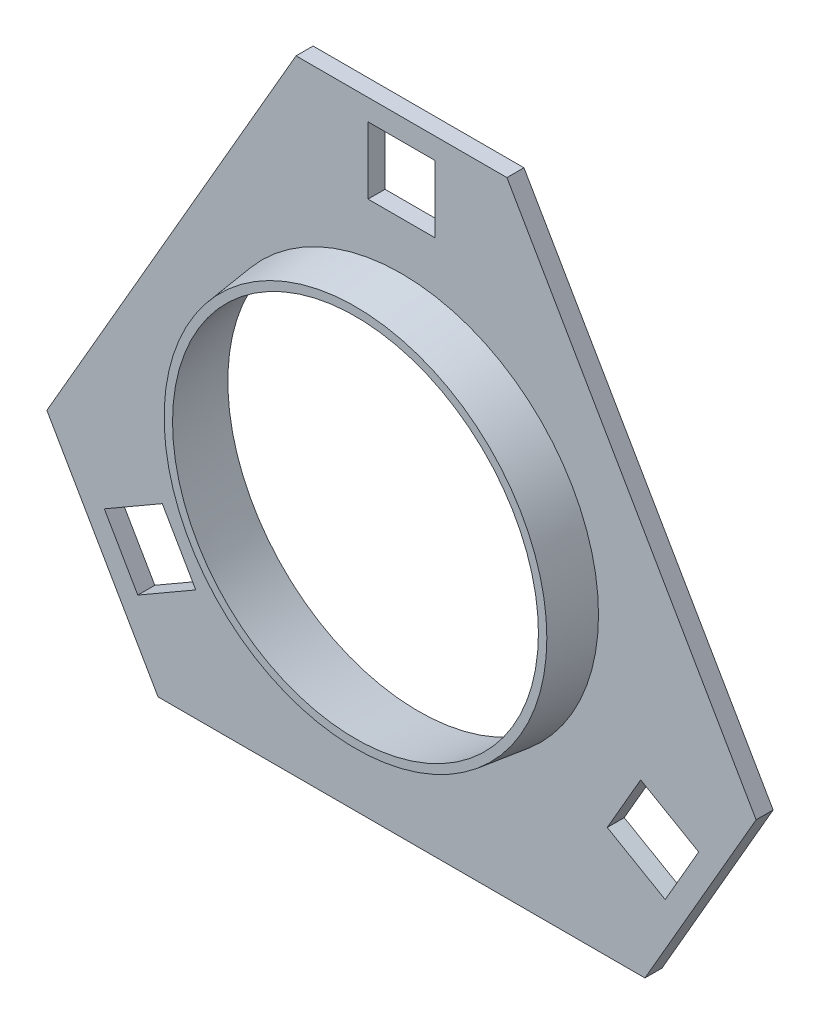
ISO-10303-21;
HEADER;
FILE_DESCRIPTION(('STEP AP214'),'2;1');
FILE_NAME('part.step','',(''),(''),'','','');
FILE_SCHEMA(('AUTOMOTIVE_DESIGN { 1 0 10303 214 1 1 1 1 }'));
ENDSEC;
DATA;
#1=APPLICATION_CONTEXT('core data for automotive mechanical design processes');
#2=APPLICATION_PROTOCOL_DEFINITION('international standard','automotive_design',2000,#1);
#3=PRODUCT_CONTEXT('',#1,'mechanical');
#4=PRODUCT('Part','Part','',(#3));
#5=PRODUCT_RELATED_PRODUCT_CATEGORY('part','',(#4));
#6=PRODUCT_DEFINITION_FORMATION('','',#4);
#7=PRODUCT_DEFINITION_CONTEXT('part definition',#1,'design');
#8=PRODUCT_DEFINITION('design','',#6,#7);
#9=PRODUCT_DEFINITION_SHAPE('','',#8);
#10=(LENGTH_UNIT() NAMED_UNIT(*) SI_UNIT(.MILLI.,.METRE.));
#11=(NAMED_UNIT(*) PLANE_ANGLE_UNIT() SI_UNIT($,.RADIAN.));
#12=(NAMED_UNIT(*) SI_UNIT($,.STERADIAN.) SOLID_ANGLE_UNIT());
#13=UNCERTAINTY_MEASURE_WITH_UNIT(LENGTH_MEASURE(1.E-05),#10,'distance_accuracy_value','');
#14=(GEOMETRIC_REPRESENTATION_CONTEXT(3) GLOBAL_UNCERTAINTY_ASSIGNED_CONTEXT((#13)) GLOBAL_UNIT_ASSIGNED_CONTEXT((#10,
#11,#12)) REPRESENTATION_CONTEXT('',''));
#15=CARTESIAN_POINT('',(0.,0.,0.));
#16=DIRECTION('',(0.,0.,1.));
#17=DIRECTION('',(1.,0.,0.));
#18=AXIS2_PLACEMENT_3D('',#15,#16,#17);
#19=CARTESIAN_POINT('',(0.,0.,2.22));
#20=DIRECTION('',(0.,0.,1.));
#21=DIRECTION('',(1.,0.,0.));
#22=AXIS2_PLACEMENT_3D('',#19,#20,#21);
#23=PLANE('',#22);
#24=DIRECTION('',(-0.499999999999999,-0.866025403784439,0.));
#25=VECTOR('',#24,1.);
#26=CARTESIAN_POINT('',(31.1972270943654,22.1025692423934,2.22));
#27=LINE('',#26,#25);
#28=CARTESIAN_POINT('',(31.1972270943654,22.1025692423934,2.22));
#29=VERTEX_POINT('',#28);
#30=CARTESIAN_POINT('',(26.8322270943654,14.5421674673553,2.22));
#31=VERTEX_POINT('',#30);
#32=EDGE_CURVE('E165',#29,#31,#27,.T.);
#33=ORIENTED_EDGE('',*,*,#32,.F.);
#34=DIRECTION('',(-0.866025403784439,0.5,0.));
#35=VECTOR('',#34,1.);
#36=CARTESIAN_POINT('',(38.7576288694036,17.7375692423934,2.22));
#37=LINE('',#36,#35);
#38=CARTESIAN_POINT('',(38.7576288694036,17.7375692423934,2.22));
#39=VERTEX_POINT('',#38);
#40=EDGE_CURVE('E157',#39,#29,#37,.T.);
#41=ORIENTED_EDGE('',*,*,#40,.F.);
#42=DIRECTION('',(0.499999999999999,0.866025403784439,0.));
#43=VECTOR('',#42,1.);
#44=CARTESIAN_POINT('',(34.3926288694035,10.1771674673551,2.22));
#45=LINE('',#44,#43);
#46=CARTESIAN_POINT('',(34.3926288694035,10.1771674673551,2.22));
#47=VERTEX_POINT('',#46);
#48=EDGE_CURVE('E180',#47,#39,#45,.T.);
#49=ORIENTED_EDGE('',*,*,#48,.F.);
#50=DIRECTION('',(0.866025403784429,-0.500000000000017,0.));
#51=VECTOR('',#50,1.);
#52=CARTESIAN_POINT('',(26.8322270943654,14.5421674673553,2.22));
#53=LINE('',#52,#51);
#54=EDGE_CURVE('E178',#31,#47,#53,.T.);
#55=ORIENTED_EDGE('',*,*,#54,.F.);
#56=EDGE_LOOP('',(#33,#41,#49,#55));
#57=FACE_BOUND('',#56,.T.);
#58=DIRECTION('',(-0.86602540378444,-0.499999999999999,0.));
#59=VECTOR('',#58,1.);
#60=CARTESIAN_POINT('',(-38.7576288694036,17.7375692423934,2.22));
#61=LINE('',#60,#59);
#62=CARTESIAN_POINT('',(-31.1972270943654,22.1025692423934,2.22));
#63=VERTEX_POINT('',#62);
#64=CARTESIAN_POINT('',(-38.7576288694036,17.7375692423934,2.22));
#65=VERTEX_POINT('',#64);
#66=EDGE_CURVE('E229',#63,#65,#61,.T.);
#67=ORIENTED_EDGE('',*,*,#66,.F.);
#68=DIRECTION('',(-0.5,0.866025403784439,0.));
#69=VECTOR('',#68,1.);
#70=CARTESIAN_POINT('',(-31.1972270943654,22.1025692423934,2.22));
#71=LINE('',#70,#69);
#72=CARTESIAN_POINT('',(-26.8322270943654,14.5421674673553,2.22));
#73=VERTEX_POINT('',#72);
#74=EDGE_CURVE('E227',#73,#63,#71,.T.);
#75=ORIENTED_EDGE('',*,*,#74,.F.);
#76=DIRECTION('',(0.866025403784429,0.500000000000017,0.));
#77=VECTOR('',#76,1.);
#78=CARTESIAN_POINT('',(-26.8322270943654,14.5421674673553,2.22));
#79=LINE('',#78,#77);
#80=CARTESIAN_POINT('',(-34.3926288694035,10.1771674673551,2.22));
#81=VERTEX_POINT('',#80);
#82=EDGE_CURVE('E235',#81,#73,#79,.T.);
#83=ORIENTED_EDGE('',*,*,#82,.F.);
#84=DIRECTION('',(0.499999999999999,-0.866025403784439,0.));
#85=VECTOR('',#84,1.);
#86=CARTESIAN_POINT('',(-34.3926288694035,10.1771674673551,2.22));
#87=LINE('',#86,#85);
#88=EDGE_CURVE('E232',#65,#81,#87,.T.);
#89=ORIENTED_EDGE('',*,*,#88,.F.);
#90=EDGE_LOOP('',(#67,#75,#83,#89));
#91=FACE_BOUND('',#90,.T.);
#92=DIRECTION('',(0.499999999999998,0.86602540378444,0.));
#93=VECTOR('',#92,1.);
#94=CARTESIAN_POINT('',(31.75,0.,2.22));
#95=LINE('',#94,#93);
#96=CARTESIAN_POINT('',(31.75,0.,2.22));
#97=VERTEX_POINT('',#96);
#98=CARTESIAN_POINT('',(46.2499999999999,25.1147367097488,2.22));
#99=VERTEX_POINT('',#98);
#100=EDGE_CURVE('E258',#97,#99,#95,.T.);
#101=ORIENTED_EDGE('',*,*,#100,.T.);
#102=DIRECTION('',(-0.500000000000004,0.866025403784436,0.));
#103=VECTOR('',#102,1.);
#104=CARTESIAN_POINT('',(46.2499999999999,25.1147367097488,2.22));
#105=LINE('',#104,#103);
#106=CARTESIAN_POINT('',(13.7499999999997,81.4063879557371,2.22));
#107=VERTEX_POINT('',#106);
#108=EDGE_CURVE('E261',#99,#107,#105,.T.);
#109=ORIENTED_EDGE('',*,*,#108,.T.);
#110=DIRECTION('',(-1.,0.,0.));
#111=VECTOR('',#110,1.);
#112=CARTESIAN_POINT('',(13.7499999999997,81.4063879557371,2.22));
#113=LINE('',#112,#111);
#114=CARTESIAN_POINT('',(-13.7499999999997,81.4063879557371,2.22));
#115=VERTEX_POINT('',#114);
#116=EDGE_CURVE('E264',#107,#115,#113,.T.);
#117=ORIENTED_EDGE('',*,*,#116,.T.);
#118=DIRECTION('',(-0.500000000000004,-0.866025403784437,0.));
#119=VECTOR('',#118,1.);
#120=CARTESIAN_POINT('',(-46.2499999999999,25.1147367097487,2.22));
#121=LINE('',#120,#119);
#122=CARTESIAN_POINT('',(-46.2499999999999,25.1147367097487,2.22));
#123=VERTEX_POINT('',#122);
#124=EDGE_CURVE('E266',#115,#123,#121,.T.);
#125=ORIENTED_EDGE('',*,*,#124,.T.);
#126=DIRECTION('',(0.499999999999998,-0.86602540378444,0.));
#127=VECTOR('',#126,1.);
#128=CARTESIAN_POINT('',(-31.75,0.,2.22));
#129=LINE('',#128,#127);
#130=CARTESIAN_POINT('',(-31.75,0.,2.22));
#131=VERTEX_POINT('',#130);
#132=EDGE_CURVE('E268',#123,#131,#129,.T.);
#133=ORIENTED_EDGE('',*,*,#132,.T.);
#134=DIRECTION('',(1.,0.,0.));
#135=VECTOR('',#134,1.);
#136=CARTESIAN_POINT('',(-31.75,0.,2.22));
#137=LINE('',#136,#135);
#138=EDGE_CURVE('E270',#131,#97,#137,.T.);
#139=ORIENTED_EDGE('',*,*,#138,.T.);
#140=EDGE_LOOP('',(#101,#109,#117,#125,#133,#139));
#141=FACE_BOUND('',#140,.T.);
#142=DIRECTION('',(-1.,0.,0.));
#143=VECTOR('',#142,1.);
#144=CARTESIAN_POINT('',(-4.365,78.6463879557371,2.22));
#145=LINE('',#144,#143);
#146=CARTESIAN_POINT('',(4.365,78.6463879557371,2.22));
#147=VERTEX_POINT('',#146);
#148=CARTESIAN_POINT('',(-4.365,78.6463879557371,2.22));
#149=VERTEX_POINT('',#148);
#150=EDGE_CURVE('E198',#147,#149,#145,.T.);
#151=ORIENTED_EDGE('',*,*,#150,.F.);
#152=DIRECTION('',(0.,1.,0.));
#153=VECTOR('',#152,1.);
#154=CARTESIAN_POINT('',(4.365,78.6463879557371,2.22));
#155=LINE('',#154,#153);
#156=CARTESIAN_POINT('',(4.365,69.9163879557371,2.22));
#157=VERTEX_POINT('',#156);
#158=EDGE_CURVE('E196',#157,#147,#155,.T.);
#159=ORIENTED_EDGE('',*,*,#158,.F.);
#160=DIRECTION('',(1.,0.,0.));
#161=VECTOR('',#160,1.);
#162=CARTESIAN_POINT('',(4.365,69.9163879557371,2.22));
#163=LINE('',#162,#161);
#164=CARTESIAN_POINT('',(-4.365,69.9163879557371,2.22));
#165=VERTEX_POINT('',#164);
#166=EDGE_CURVE('E204',#165,#157,#163,.T.);
#167=ORIENTED_EDGE('',*,*,#166,.F.);
#168=DIRECTION('',(0.,-1.,0.));
#169=VECTOR('',#168,1.);
#170=CARTESIAN_POINT('',(-4.365,78.6463879557371,2.22));
#171=LINE('',#170,#169);
#172=EDGE_CURVE('E201',#149,#165,#171,.T.);
#173=ORIENTED_EDGE('',*,*,#172,.F.);
#174=EDGE_LOOP('',(#151,#159,#167,#173));
#175=FACE_BOUND('',#174,.T.);
#176=CARTESIAN_POINT('',(0.,38.,2.22));
#177=DIRECTION('',(0.,0.,1.));
#178=DIRECTION('',(1.,0.,0.));
#179=AXIS2_PLACEMENT_3D('',#176,#177,#178);
#180=CIRCLE('',#179,25.695);
#181=CARTESIAN_POINT('',(25.695,38.,2.22));
#182=VERTEX_POINT('',#181);
#183=EDGE_CURVE('E405',#182,#182,#180,.T.);
#184=ORIENTED_EDGE('',*,*,#183,.F.);
#185=EDGE_LOOP('',(#184));
#186=FACE_BOUND('',#185,.T.);
#187=ADVANCED_FACE('F32',(#57,#91,#141,#175,#186),#23,.T.);
#188=CARTESIAN_POINT('',(0.,0.,0.));
#189=DIRECTION('',(0.,0.,1.));
#190=DIRECTION('',(1.,0.,0.));
#191=AXIS2_PLACEMENT_3D('',#188,#189,#190);
#192=PLANE('',#191);
#193=CARTESIAN_POINT('',(0.,38.,0.));
#194=DIRECTION('',(0.,0.,1.));
#195=DIRECTION('',(1.,0.,0.));
#196=AXIS2_PLACEMENT_3D('',#193,#194,#195);
#197=CIRCLE('',#196,24.8692890906219);
#198=CARTESIAN_POINT('',(24.8692890906219,38.,0.));
#199=VERTEX_POINT('',#198);
#200=EDGE_CURVE('E400',#199,#199,#197,.T.);
#201=ORIENTED_EDGE('',*,*,#200,.T.);
#202=EDGE_LOOP('',(#201));
#203=FACE_BOUND('',#202,.T.);
#204=DIRECTION('',(0.,1.,0.));
#205=VECTOR('',#204,1.);
#206=CARTESIAN_POINT('',(4.365,78.6463879557371,0.));
#207=LINE('',#206,#205);
#208=CARTESIAN_POINT('',(4.365,69.9163879557371,0.));
#209=VERTEX_POINT('',#208);
#210=CARTESIAN_POINT('',(4.365,78.6463879557371,0.));
#211=VERTEX_POINT('',#210);
#212=EDGE_CURVE('E173',#209,#211,#207,.T.);
#213=ORIENTED_EDGE('',*,*,#212,.T.);
#214=DIRECTION('',(-1.,0.,0.));
#215=VECTOR('',#214,1.);
#216=CARTESIAN_POINT('',(-4.365,78.6463879557371,0.));
#217=LINE('',#216,#215);
#218=CARTESIAN_POINT('',(-4.365,78.6463879557371,0.));
#219=VERTEX_POINT('',#218);
#220=EDGE_CURVE('E209',#211,#219,#217,.T.);
#221=ORIENTED_EDGE('',*,*,#220,.T.);
#222=DIRECTION('',(0.,-1.,0.));
#223=VECTOR('',#222,1.);
#224=CARTESIAN_POINT('',(-4.365,78.6463879557371,0.));
#225=LINE('',#224,#223);
#226=CARTESIAN_POINT('',(-4.365,69.9163879557371,0.));
#227=VERTEX_POINT('',#226);
#228=EDGE_CURVE('E212',#219,#227,#225,.T.);
#229=ORIENTED_EDGE('',*,*,#228,.T.);
#230=DIRECTION('',(1.,0.,0.));
#231=VECTOR('',#230,1.);
#232=CARTESIAN_POINT('',(4.365,69.9163879557371,0.));
#233=LINE('',#232,#231);
#234=EDGE_CURVE('E199',#227,#209,#233,.T.);
#235=ORIENTED_EDGE('',*,*,#234,.T.);
#236=EDGE_LOOP('',(#213,#221,#229,#235));
#237=FACE_BOUND('',#236,.T.);
#238=DIRECTION('',(0.499999999999998,0.86602540378444,0.));
#239=VECTOR('',#238,1.);
#240=CARTESIAN_POINT('',(31.75,0.,0.));
#241=LINE('',#240,#239);
#242=CARTESIAN_POINT('',(31.75,0.,0.));
#243=VERTEX_POINT('',#242);
#244=CARTESIAN_POINT('',(46.2499999999999,25.1147367097488,0.));
#245=VERTEX_POINT('',#244);
#246=EDGE_CURVE('E257',#243,#245,#241,.T.);
#247=ORIENTED_EDGE('',*,*,#246,.F.);
#248=DIRECTION('',(1.,0.,0.));
#249=VECTOR('',#248,1.);
#250=CARTESIAN_POINT('',(-31.75,0.,0.));
#251=LINE('',#250,#249);
#252=CARTESIAN_POINT('',(-31.75,0.,0.));
#253=VERTEX_POINT('',#252);
#254=EDGE_CURVE('E262',#253,#243,#251,.T.);
#255=ORIENTED_EDGE('',*,*,#254,.F.);
#256=DIRECTION('',(0.499999999999998,-0.86602540378444,0.));
#257=VECTOR('',#256,1.);
#258=CARTESIAN_POINT('',(-31.75,0.,0.));
#259=LINE('',#258,#257);
#260=CARTESIAN_POINT('',(-46.2499999999999,25.1147367097487,0.));
#261=VERTEX_POINT('',#260);
#262=EDGE_CURVE('E281',#261,#253,#259,.T.);
#263=ORIENTED_EDGE('',*,*,#262,.F.);
#264=DIRECTION('',(-0.500000000000004,-0.866025403784437,0.));
#265=VECTOR('',#264,1.);
#266=CARTESIAN_POINT('',(-46.2499999999999,25.1147367097487,0.));
#267=LINE('',#266,#265);
#268=CARTESIAN_POINT('',(-13.7499999999997,81.4063879557371,0.));
#269=VERTEX_POINT('',#268);
#270=EDGE_CURVE('E279',#269,#261,#267,.T.);
#271=ORIENTED_EDGE('',*,*,#270,.F.);
#272=DIRECTION('',(-1.,0.,0.));
#273=VECTOR('',#272,1.);
#274=CARTESIAN_POINT('',(13.7499999999997,81.4063879557371,0.));
#275=LINE('',#274,#273);
#276=CARTESIAN_POINT('',(13.7499999999997,81.4063879557371,0.));
#277=VERTEX_POINT('',#276);
#278=EDGE_CURVE('E277',#277,#269,#275,.T.);
#279=ORIENTED_EDGE('',*,*,#278,.F.);
#280=DIRECTION('',(-0.500000000000004,0.866025403784436,0.));
#281=VECTOR('',#280,1.);
#282=CARTESIAN_POINT('',(46.2499999999999,25.1147367097488,0.));
#283=LINE('',#282,#281);
#284=EDGE_CURVE('E275',#245,#277,#283,.T.);
#285=ORIENTED_EDGE('',*,*,#284,.F.);
#286=EDGE_LOOP('',(#247,#255,#263,#271,#279,#285));
#287=FACE_BOUND('',#286,.T.);
#288=DIRECTION('',(-0.5,0.866025403784439,0.));
#289=VECTOR('',#288,1.);
#290=CARTESIAN_POINT('',(-31.1972270943654,22.1025692423934,0.));
#291=LINE('',#290,#289);
#292=CARTESIAN_POINT('',(-26.8322270943654,14.5421674673553,0.));
#293=VERTEX_POINT('',#292);
#294=CARTESIAN_POINT('',(-31.1972270943654,22.1025692423934,0.));
#295=VERTEX_POINT('',#294);
#296=EDGE_CURVE('E226',#293,#295,#291,.T.);
#297=ORIENTED_EDGE('',*,*,#296,.T.);
#298=DIRECTION('',(-0.86602540378444,-0.499999999999999,0.));
#299=VECTOR('',#298,1.);
#300=CARTESIAN_POINT('',(-38.7576288694036,17.7375692423934,0.));
#301=LINE('',#300,#299);
#302=CARTESIAN_POINT('',(-38.7576288694036,17.7375692423934,0.));
#303=VERTEX_POINT('',#302);
#304=EDGE_CURVE('E240',#295,#303,#301,.T.);
#305=ORIENTED_EDGE('',*,*,#304,.T.);
#306=DIRECTION('',(0.499999999999999,-0.866025403784439,0.));
#307=VECTOR('',#306,1.);
#308=CARTESIAN_POINT('',(-34.3926288694035,10.1771674673551,0.));
#309=LINE('',#308,#307);
#310=CARTESIAN_POINT('',(-34.3926288694035,10.1771674673551,0.));
#311=VERTEX_POINT('',#310);
#312=EDGE_CURVE('E243',#303,#311,#309,.T.);
#313=ORIENTED_EDGE('',*,*,#312,.T.);
#314=DIRECTION('',(0.866025403784429,0.500000000000017,0.));
#315=VECTOR('',#314,1.);
#316=CARTESIAN_POINT('',(-26.8322270943654,14.5421674673553,0.));
#317=LINE('',#316,#315);
#318=EDGE_CURVE('E230',#311,#293,#317,.T.);
#319=ORIENTED_EDGE('',*,*,#318,.T.);
#320=EDGE_LOOP('',(#297,#305,#313,#319));
#321=FACE_BOUND('',#320,.T.);
#322=DIRECTION('',(-0.866025403784439,0.5,0.));
#323=VECTOR('',#322,1.);
#324=CARTESIAN_POINT('',(38.7576288694036,17.7375692423934,0.));
#325=LINE('',#324,#323);
#326=CARTESIAN_POINT('',(38.7576288694036,17.7375692423934,0.));
#327=VERTEX_POINT('',#326);
#328=CARTESIAN_POINT('',(31.1972270943654,22.1025692423934,0.));
#329=VERTEX_POINT('',#328);
#330=EDGE_CURVE('E55',#327,#329,#325,.T.);
#331=ORIENTED_EDGE('',*,*,#330,.T.);
#332=DIRECTION('',(-0.499999999999999,-0.866025403784439,0.));
#333=VECTOR('',#332,1.);
#334=CARTESIAN_POINT('',(31.1972270943654,22.1025692423934,0.));
#335=LINE('',#334,#333);
#336=CARTESIAN_POINT('',(26.8322270943654,14.5421674673553,0.));
#337=VERTEX_POINT('',#336);
#338=EDGE_CURVE('E172',#329,#337,#335,.T.);
#339=ORIENTED_EDGE('',*,*,#338,.T.);
#340=DIRECTION('',(0.866025403784429,-0.500000000000017,0.));
#341=VECTOR('',#340,1.);
#342=CARTESIAN_POINT('',(26.8322270943654,14.5421674673553,0.));
#343=LINE('',#342,#341);
#344=CARTESIAN_POINT('',(34.3926288694035,10.1771674673551,0.));
#345=VERTEX_POINT('',#344);
#346=EDGE_CURVE('E188',#337,#345,#343,.T.);
#347=ORIENTED_EDGE('',*,*,#346,.T.);
#348=DIRECTION('',(0.499999999999999,0.866025403784439,0.));
#349=VECTOR('',#348,1.);
#350=CARTESIAN_POINT('',(34.3926288694035,10.1771674673551,0.));
#351=LINE('',#350,#349);
#352=EDGE_CURVE('E166',#345,#327,#351,.T.);
#353=ORIENTED_EDGE('',*,*,#352,.T.);
#354=EDGE_LOOP('',(#331,#339,#347,#353));
#355=FACE_BOUND('',#354,.T.);
#356=ADVANCED_FACE('F305',(#203,#237,#287,#321,#355),#192,.F.);
#357=CARTESIAN_POINT('',(31.75,0.,2.22));
#358=DIRECTION('',(-0.86602540378444,0.499999999999998,0.));
#359=DIRECTION('',(-0.499999999999998,-0.86602540378444,0.));
#360=AXIS2_PLACEMENT_3D('',#357,#358,#359);
#361=PLANE('',#360);
#362=ORIENTED_EDGE('',*,*,#246,.T.);
#363=DIRECTION('',(0.,0.,-1.));
#364=VECTOR('',#363,1.);
#365=CARTESIAN_POINT('',(46.2499999999999,25.1147367097488,2.22));
#366=LINE('',#365,#364);
#367=EDGE_CURVE('E11',#99,#245,#366,.T.);
#368=ORIENTED_EDGE('',*,*,#367,.F.);
#369=ORIENTED_EDGE('',*,*,#100,.F.);
#370=DIRECTION('',(0.,0.,-1.));
#371=VECTOR('',#370,1.);
#372=CARTESIAN_POINT('',(31.75,0.,2.22));
#373=LINE('',#372,#371);
#374=EDGE_CURVE('E272',#97,#243,#373,.T.);
#375=ORIENTED_EDGE('',*,*,#374,.T.);
#376=EDGE_LOOP('',(#362,#368,#369,#375));
#377=FACE_BOUND('',#376,.T.);
#378=ADVANCED_FACE('F34',(#377),#361,.F.);
#379=CARTESIAN_POINT('',(46.2499999999999,25.1147367097488,2.22));
#380=DIRECTION('',(-0.866025403784436,-0.500000000000004,0.));
#381=DIRECTION('',(0.500000000000004,-0.866025403784437,0.));
#382=AXIS2_PLACEMENT_3D('',#379,#380,#381);
#383=PLANE('',#382);
#384=ORIENTED_EDGE('',*,*,#284,.T.);
#385=DIRECTION('',(0.,0.,-1.));
#386=VECTOR('',#385,1.);
#387=CARTESIAN_POINT('',(13.7499999999997,81.4063879557371,2.22));
#388=LINE('',#387,#386);
#389=EDGE_CURVE('E40',#107,#277,#388,.T.);
#390=ORIENTED_EDGE('',*,*,#389,.F.);
#391=ORIENTED_EDGE('',*,*,#108,.F.);
#392=ORIENTED_EDGE('',*,*,#367,.T.);
#393=EDGE_LOOP('',(#384,#390,#391,#392));
#394=FACE_BOUND('',#393,.T.);
#395=ADVANCED_FACE('F323',(#394),#383,.F.);
#396=CARTESIAN_POINT('',(13.7499999999997,81.4063879557371,2.22));
#397=DIRECTION('',(0.,-1.,0.));
#398=DIRECTION('',(0.,0.,-1.));
#399=AXIS2_PLACEMENT_3D('',#396,#397,#398);
#400=PLANE('',#399);
#401=ORIENTED_EDGE('',*,*,#278,.T.);
#402=DIRECTION('',(0.,0.,-1.));
#403=VECTOR('',#402,1.);
#404=CARTESIAN_POINT('',(-13.7499999999997,81.4063879557371,2.22));
#405=LINE('',#404,#403);
#406=EDGE_CURVE('E292',#115,#269,#405,.T.);
#407=ORIENTED_EDGE('',*,*,#406,.F.);
#408=ORIENTED_EDGE('',*,*,#116,.F.);
#409=ORIENTED_EDGE('',*,*,#389,.T.);
#410=EDGE_LOOP('',(#401,#407,#408,#409));
#411=FACE_BOUND('',#410,.T.);
#412=ADVANCED_FACE('F299',(#411),#400,.F.);
#413=CARTESIAN_POINT('',(-46.2499999999999,25.1147367097487,2.22));
#414=DIRECTION('',(0.866025403784437,-0.500000000000003,0.));
#415=DIRECTION('',(0.500000000000004,0.866025403784437,0.));
#416=AXIS2_PLACEMENT_3D('',#413,#414,#415);
#417=PLANE('',#416);
#418=ORIENTED_EDGE('',*,*,#270,.T.);
#419=DIRECTION('',(0.,0.,-1.));
#420=VECTOR('',#419,1.);
#421=CARTESIAN_POINT('',(-46.2499999999999,25.1147367097487,2.22));
#422=LINE('',#421,#420);
#423=EDGE_CURVE('E289',#123,#261,#422,.T.);
#424=ORIENTED_EDGE('',*,*,#423,.F.);
#425=ORIENTED_EDGE('',*,*,#124,.F.);
#426=ORIENTED_EDGE('',*,*,#406,.T.);
#427=EDGE_LOOP('',(#418,#424,#425,#426));
#428=FACE_BOUND('',#427,.T.);
#429=ADVANCED_FACE('F311',(#428),#417,.F.);
#430=CARTESIAN_POINT('',(-31.75,0.,2.22));
#431=DIRECTION('',(0.86602540378444,0.499999999999998,0.));
#432=DIRECTION('',(-0.499999999999998,0.86602540378444,0.));
#433=AXIS2_PLACEMENT_3D('',#430,#431,#432);
#434=PLANE('',#433);
#435=ORIENTED_EDGE('',*,*,#262,.T.);
#436=DIRECTION('',(0.,0.,-1.));
#437=VECTOR('',#436,1.);
#438=CARTESIAN_POINT('',(-31.75,0.,2.22));
#439=LINE('',#438,#437);
#440=EDGE_CURVE('E286',#131,#253,#439,.T.);
#441=ORIENTED_EDGE('',*,*,#440,.F.);
#442=ORIENTED_EDGE('',*,*,#132,.F.);
#443=ORIENTED_EDGE('',*,*,#423,.T.);
#444=EDGE_LOOP('',(#435,#441,#442,#443));
#445=FACE_BOUND('',#444,.T.);
#446=ADVANCED_FACE('F315',(#445),#434,.F.);
#447=CARTESIAN_POINT('',(-31.75,0.,2.22));
#448=DIRECTION('',(0.,1.,0.));
#449=DIRECTION('',(0.,0.,1.));
#450=AXIS2_PLACEMENT_3D('',#447,#448,#449);
#451=PLANE('',#450);
#452=ORIENTED_EDGE('',*,*,#254,.T.);
#453=ORIENTED_EDGE('',*,*,#374,.F.);
#454=ORIENTED_EDGE('',*,*,#138,.F.);
#455=ORIENTED_EDGE('',*,*,#440,.T.);
#456=EDGE_LOOP('',(#452,#453,#454,#455));
#457=FACE_BOUND('',#456,.T.);
#458=ADVANCED_FACE('F326',(#457),#451,.F.);
#459=CARTESIAN_POINT('',(-31.1972270943654,22.1025692423934,2.22));
#460=DIRECTION('',(-0.866025403784439,-0.5,0.));
#461=DIRECTION('',(0.5,-0.866025403784439,0.));
#462=AXIS2_PLACEMENT_3D('',#459,#460,#461);
#463=PLANE('',#462);
#464=ORIENTED_EDGE('',*,*,#296,.F.);
#465=DIRECTION('',(0.,0.,-1.));
#466=VECTOR('',#465,1.);
#467=CARTESIAN_POINT('',(-26.8322270943654,14.5421674673553,2.22));
#468=LINE('',#467,#466);
#469=EDGE_CURVE('E237',#73,#293,#468,.T.);
#470=ORIENTED_EDGE('',*,*,#469,.F.);
#471=ORIENTED_EDGE('',*,*,#74,.T.);
#472=DIRECTION('',(0.,0.,-1.));
#473=VECTOR('',#472,1.);
#474=CARTESIAN_POINT('',(-31.1972270943654,22.1025692423934,2.22));
#475=LINE('',#474,#473);
#476=EDGE_CURVE('E254',#63,#295,#475,.T.);
#477=ORIENTED_EDGE('',*,*,#476,.T.);
#478=EDGE_LOOP('',(#464,#470,#471,#477));
#479=FACE_BOUND('',#478,.T.);
#480=ADVANCED_FACE('F328',(#479),#463,.T.);
#481=CARTESIAN_POINT('',(-38.7576288694036,17.7375692423934,2.22));
#482=DIRECTION('',(0.499999999999999,-0.866025403784439,0.));
#483=DIRECTION('',(0.86602540378444,0.499999999999999,0.));
#484=AXIS2_PLACEMENT_3D('',#481,#482,#483);
#485=PLANE('',#484);
#486=ORIENTED_EDGE('',*,*,#304,.F.);
#487=ORIENTED_EDGE('',*,*,#476,.F.);
#488=ORIENTED_EDGE('',*,*,#66,.T.);
#489=DIRECTION('',(0.,0.,-1.));
#490=VECTOR('',#489,1.);
#491=CARTESIAN_POINT('',(-38.7576288694036,17.7375692423934,2.22));
#492=LINE('',#491,#490);
#493=EDGE_CURVE('E252',#65,#303,#492,.T.);
#494=ORIENTED_EDGE('',*,*,#493,.T.);
#495=EDGE_LOOP('',(#486,#487,#488,#494));
#496=FACE_BOUND('',#495,.T.);
#497=ADVANCED_FACE('F334',(#496),#485,.T.);
#498=CARTESIAN_POINT('',(-34.3926288694035,10.1771674673551,2.22));
#499=DIRECTION('',(0.866025403784439,0.499999999999999,0.));
#500=DIRECTION('',(-0.499999999999999,0.866025403784439,0.));
#501=AXIS2_PLACEMENT_3D('',#498,#499,#500);
#502=PLANE('',#501);
#503=ORIENTED_EDGE('',*,*,#312,.F.);
#504=ORIENTED_EDGE('',*,*,#493,.F.);
#505=ORIENTED_EDGE('',*,*,#88,.T.);
#506=DIRECTION('',(0.,0.,-1.));
#507=VECTOR('',#506,1.);
#508=CARTESIAN_POINT('',(-34.3926288694035,10.1771674673551,2.22));
#509=LINE('',#508,#507);
#510=EDGE_CURVE('E250',#81,#311,#509,.T.);
#511=ORIENTED_EDGE('',*,*,#510,.T.);
#512=EDGE_LOOP('',(#503,#504,#505,#511));
#513=FACE_BOUND('',#512,.T.);
#514=ADVANCED_FACE('F348',(#513),#502,.T.);
#515=CARTESIAN_POINT('',(-26.8322270943654,14.5421674673553,2.22));
#516=DIRECTION('',(-0.500000000000017,0.866025403784429,0.));
#517=DIRECTION('',(-0.866025403784429,-0.500000000000017,0.));
#518=AXIS2_PLACEMENT_3D('',#515,#516,#517);
#519=PLANE('',#518);
#520=ORIENTED_EDGE('',*,*,#318,.F.);
#521=ORIENTED_EDGE('',*,*,#510,.F.);
#522=ORIENTED_EDGE('',*,*,#82,.T.);
#523=ORIENTED_EDGE('',*,*,#469,.T.);
#524=EDGE_LOOP('',(#520,#521,#522,#523));
#525=FACE_BOUND('',#524,.T.);
#526=ADVANCED_FACE('F352',(#525),#519,.T.);
#527=CARTESIAN_POINT('',(4.365,78.6463879557371,2.22));
#528=DIRECTION('',(-1.,0.,0.));
#529=DIRECTION('',(0.,-1.,0.));
#530=AXIS2_PLACEMENT_3D('',#527,#528,#529);
#531=PLANE('',#530);
#532=ORIENTED_EDGE('',*,*,#212,.F.);
#533=DIRECTION('',(0.,0.,-1.));
#534=VECTOR('',#533,1.);
#535=CARTESIAN_POINT('',(4.365,69.9163879557371,2.22));
#536=LINE('',#535,#534);
#537=EDGE_CURVE('E206',#157,#209,#536,.T.);
#538=ORIENTED_EDGE('',*,*,#537,.F.);
#539=ORIENTED_EDGE('',*,*,#158,.T.);
#540=DIRECTION('',(0.,0.,-1.));
#541=VECTOR('',#540,1.);
#542=CARTESIAN_POINT('',(4.365,78.6463879557371,2.22));
#543=LINE('',#542,#541);
#544=EDGE_CURVE('E223',#147,#211,#543,.T.);
#545=ORIENTED_EDGE('',*,*,#544,.T.);
#546=EDGE_LOOP('',(#532,#538,#539,#545));
#547=FACE_BOUND('',#546,.T.);
#548=ADVANCED_FACE('F356',(#547),#531,.T.);
#549=CARTESIAN_POINT('',(-4.365,78.6463879557371,2.22));
#550=DIRECTION('',(0.,-1.,0.));
#551=DIRECTION('',(0.,0.,-1.));
#552=AXIS2_PLACEMENT_3D('',#549,#550,#551);
#553=PLANE('',#552);
#554=ORIENTED_EDGE('',*,*,#220,.F.);
#555=ORIENTED_EDGE('',*,*,#544,.F.);
#556=ORIENTED_EDGE('',*,*,#150,.T.);
#557=DIRECTION('',(0.,0.,-1.));
#558=VECTOR('',#557,1.);
#559=CARTESIAN_POINT('',(-4.365,78.6463879557371,2.22));
#560=LINE('',#559,#558);
#561=EDGE_CURVE('E221',#149,#219,#560,.T.);
#562=ORIENTED_EDGE('',*,*,#561,.T.);
#563=EDGE_LOOP('',(#554,#555,#556,#562));
#564=FACE_BOUND('',#563,.T.);
#565=ADVANCED_FACE('F360',(#564),#553,.T.);
#566=CARTESIAN_POINT('',(-4.365,78.6463879557371,2.22));
#567=DIRECTION('',(1.,0.,0.));
#568=DIRECTION('',(0.,1.,0.));
#569=AXIS2_PLACEMENT_3D('',#566,#567,#568);
#570=PLANE('',#569);
#571=ORIENTED_EDGE('',*,*,#228,.F.);
#572=ORIENTED_EDGE('',*,*,#561,.F.);
#573=ORIENTED_EDGE('',*,*,#172,.T.);
#574=DIRECTION('',(0.,0.,-1.));
#575=VECTOR('',#574,1.);
#576=CARTESIAN_POINT('',(-4.365,69.9163879557371,2.22));
#577=LINE('',#576,#575);
#578=EDGE_CURVE('E219',#165,#227,#577,.T.);
#579=ORIENTED_EDGE('',*,*,#578,.T.);
#580=EDGE_LOOP('',(#571,#572,#573,#579));
#581=FACE_BOUND('',#580,.T.);
#582=ADVANCED_FACE('F364',(#581),#570,.T.);
#583=CARTESIAN_POINT('',(4.365,69.9163879557371,2.22));
#584=DIRECTION('',(0.,1.,0.));
#585=DIRECTION('',(0.,0.,1.));
#586=AXIS2_PLACEMENT_3D('',#583,#584,#585);
#587=PLANE('',#586);
#588=ORIENTED_EDGE('',*,*,#234,.F.);
#589=ORIENTED_EDGE('',*,*,#578,.F.);
#590=ORIENTED_EDGE('',*,*,#166,.T.);
#591=ORIENTED_EDGE('',*,*,#537,.T.);
#592=EDGE_LOOP('',(#588,#589,#590,#591));
#593=FACE_BOUND('',#592,.T.);
#594=ADVANCED_FACE('F368',(#593),#587,.T.);
#595=CARTESIAN_POINT('',(38.7576288694036,17.7375692423934,2.22));
#596=DIRECTION('',(-0.5,-0.866025403784439,0.));
#597=DIRECTION('',(0.866025403784439,-0.5,0.));
#598=AXIS2_PLACEMENT_3D('',#595,#596,#597);
#599=PLANE('',#598);
#600=ORIENTED_EDGE('',*,*,#330,.F.);
#601=DIRECTION('',(0.,0.,-1.));
#602=VECTOR('',#601,1.);
#603=CARTESIAN_POINT('',(38.7576288694036,17.7375692423934,2.22));
#604=LINE('',#603,#602);
#605=EDGE_CURVE('E161',#39,#327,#604,.T.);
#606=ORIENTED_EDGE('',*,*,#605,.F.);
#607=ORIENTED_EDGE('',*,*,#40,.T.);
#608=DIRECTION('',(0.,0.,-1.));
#609=VECTOR('',#608,1.);
#610=CARTESIAN_POINT('',(31.1972270943654,22.1025692423934,2.22));
#611=LINE('',#610,#609);
#612=EDGE_CURVE('E160',#29,#329,#611,.T.);
#613=ORIENTED_EDGE('',*,*,#612,.T.);
#614=EDGE_LOOP('',(#600,#606,#607,#613));
#615=FACE_BOUND('',#614,.T.);
#616=ADVANCED_FACE('F159',(#615),#599,.T.);
#617=CARTESIAN_POINT('',(31.1972270943654,22.1025692423934,2.22));
#618=DIRECTION('',(0.866025403784439,-0.499999999999999,0.));
#619=DIRECTION('',(0.499999999999999,0.866025403784439,0.));
#620=AXIS2_PLACEMENT_3D('',#617,#618,#619);
#621=PLANE('',#620);
#622=ORIENTED_EDGE('',*,*,#338,.F.);
#623=ORIENTED_EDGE('',*,*,#612,.F.);
#624=ORIENTED_EDGE('',*,*,#32,.T.);
#625=DIRECTION('',(0.,0.,-1.));
#626=VECTOR('',#625,1.);
#627=CARTESIAN_POINT('',(26.8322270943654,14.5421674673553,2.22));
#628=LINE('',#627,#626);
#629=EDGE_CURVE('E174',#31,#337,#628,.T.);
#630=ORIENTED_EDGE('',*,*,#629,.T.);
#631=EDGE_LOOP('',(#622,#623,#624,#630));
#632=FACE_BOUND('',#631,.T.);
#633=ADVANCED_FACE('F169',(#632),#621,.T.);
#634=CARTESIAN_POINT('',(26.8322270943654,14.5421674673553,2.22));
#635=DIRECTION('',(0.500000000000017,0.866025403784429,0.));
#636=DIRECTION('',(-0.866025403784429,0.500000000000017,0.));
#637=AXIS2_PLACEMENT_3D('',#634,#635,#636);
#638=PLANE('',#637);
#639=ORIENTED_EDGE('',*,*,#346,.F.);
#640=ORIENTED_EDGE('',*,*,#629,.F.);
#641=ORIENTED_EDGE('',*,*,#54,.T.);
#642=DIRECTION('',(0.,0.,-1.));
#643=VECTOR('',#642,1.);
#644=CARTESIAN_POINT('',(34.3926288694035,10.1771674673551,2.22));
#645=LINE('',#644,#643);
#646=EDGE_CURVE('E47',#47,#345,#645,.T.);
#647=ORIENTED_EDGE('',*,*,#646,.T.);
#648=EDGE_LOOP('',(#639,#640,#641,#647));
#649=FACE_BOUND('',#648,.T.);
#650=ADVANCED_FACE('F377',(#649),#638,.T.);
#651=CARTESIAN_POINT('',(34.3926288694035,10.1771674673551,2.22));
#652=DIRECTION('',(-0.866025403784439,0.499999999999999,0.));
#653=DIRECTION('',(-0.499999999999999,-0.866025403784439,0.));
#654=AXIS2_PLACEMENT_3D('',#651,#652,#653);
#655=PLANE('',#654);
#656=ORIENTED_EDGE('',*,*,#352,.F.);
#657=ORIENTED_EDGE('',*,*,#646,.F.);
#658=ORIENTED_EDGE('',*,*,#48,.T.);
#659=ORIENTED_EDGE('',*,*,#605,.T.);
#660=EDGE_LOOP('',(#656,#657,#658,#659));
#661=FACE_BOUND('',#660,.T.);
#662=ADVANCED_FACE('F380',(#661),#655,.T.);
#663=CARTESIAN_POINT('',(0.,38.,2.22));
#664=DIRECTION('',(0.,0.,-1.));
#665=DIRECTION('',(1.,0.,0.));
#666=AXIS2_PLACEMENT_3D('',#663,#664,#665);
#667=CONICAL_SURFACE('',#666,25.695,0.122173047639603);
#668=CARTESIAN_POINT('',(0.,38.,8.22));
#669=DIRECTION('',(0.,0.,1.));
#670=DIRECTION('',(1.,0.,0.));
#671=AXIS2_PLACEMENT_3D('',#668,#669,#670);
#672=CIRCLE('',#671,24.9582926345826);
#673=CARTESIAN_POINT('',(24.9582926345826,38.,8.22));
#674=VERTEX_POINT('',#673);
#675=EDGE_CURVE('E186',#674,#674,#672,.T.);
#676=ORIENTED_EDGE('',*,*,#675,.F.);
#677=EDGE_LOOP('',(#676));
#678=FACE_BOUND('',#677,.T.);
#679=ORIENTED_EDGE('',*,*,#183,.T.);
#680=EDGE_LOOP('',(#679));
#681=FACE_BOUND('',#680,.T.);
#682=ADVANCED_FACE('F384',(#678,#681),#667,.T.);
#683=CARTESIAN_POINT('',(0.,38.,8.22));
#684=DIRECTION('',(0.,0.,1.));
#685=DIRECTION('',(1.,0.,0.));
#686=AXIS2_PLACEMENT_3D('',#683,#684,#685);
#687=PLANE('',#686);
#688=CARTESIAN_POINT('',(0.,38.,8.22));
#689=DIRECTION('',(0.,0.,1.));
#690=DIRECTION('',(1.,0.,0.));
#691=AXIS2_PLACEMENT_3D('',#688,#689,#690);
#692=CIRCLE('',#691,23.86);
#693=CARTESIAN_POINT('',(23.86,38.,8.22));
#694=VERTEX_POINT('',#693);
#695=EDGE_CURVE('E403',#694,#694,#692,.T.);
#696=ORIENTED_EDGE('',*,*,#695,.F.);
#697=EDGE_LOOP('',(#696));
#698=FACE_BOUND('',#697,.T.);
#699=ORIENTED_EDGE('',*,*,#675,.T.);
#700=EDGE_LOOP('',(#699));
#701=FACE_BOUND('',#700,.T.);
#702=ADVANCED_FACE('F387',(#698,#701),#687,.T.);
#703=CARTESIAN_POINT('',(0.,38.,8.22));
#704=DIRECTION('',(0.,0.,-1.));
#705=DIRECTION('',(1.,0.,0.));
#706=AXIS2_PLACEMENT_3D('',#703,#704,#705);
#707=CONICAL_SURFACE('',#706,23.86,0.122173047639603);
#708=ORIENTED_EDGE('',*,*,#200,.F.);
#709=EDGE_LOOP('',(#708));
#710=FACE_BOUND('',#709,.T.);
#711=ORIENTED_EDGE('',*,*,#695,.T.);
#712=EDGE_LOOP('',(#711));
#713=FACE_BOUND('',#712,.T.);
#714=ADVANCED_FACE('F391',(#710,#713),#707,.F.);
#715=CLOSED_SHELL('',(#187,#356,#378,#395,#412,#429,#446,#458,#480,#497,#514,#526,#548,#565,
#582,#594,#616,#633,#650,#662,#682,#702,#714));
#716=MANIFOLD_SOLID_BREP('B2',#715);
#717=ADVANCED_BREP_SHAPE_REPRESENTATION('',(#18,#716),#14);
#718=SHAPE_DEFINITION_REPRESENTATION(#9,#717);
ENDSEC;
END-ISO-10303-21;
